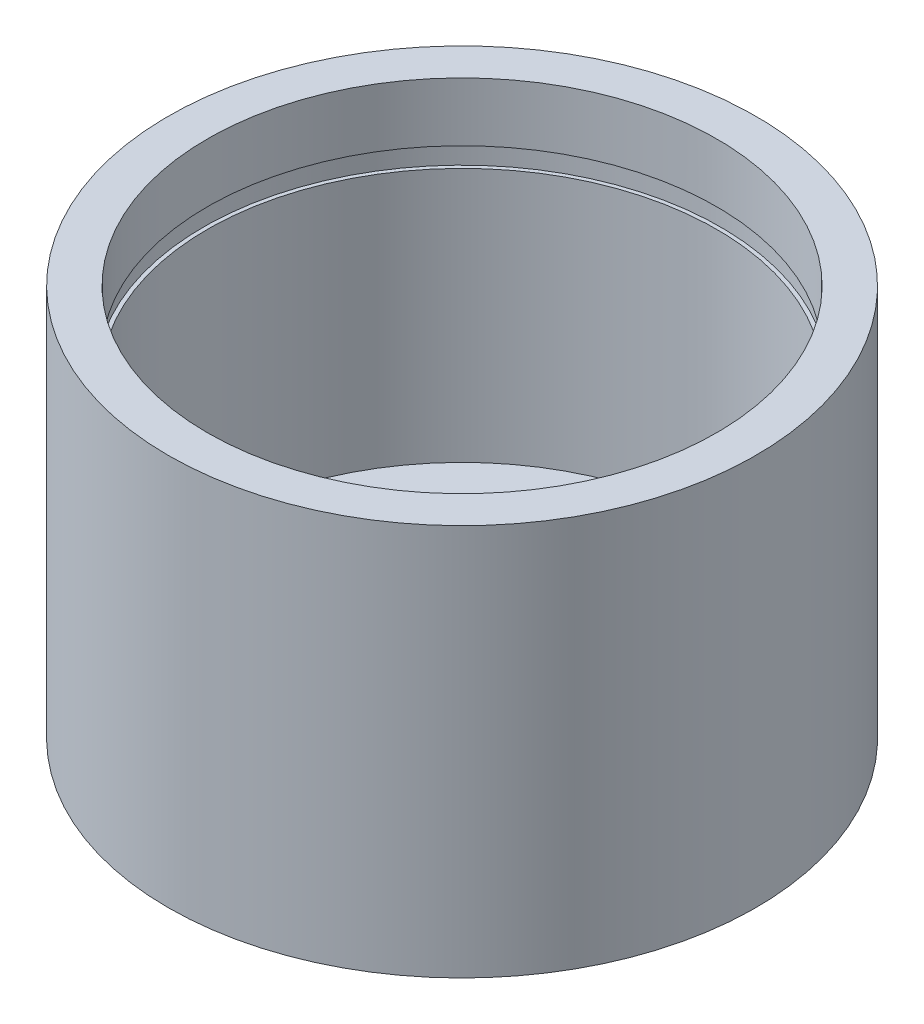
ISO-10303-21;
HEADER;
FILE_DESCRIPTION(('STEP AP214'),'2;1');
FILE_NAME('part.step','',(''),(''),'','','');
FILE_SCHEMA(('AUTOMOTIVE_DESIGN { 1 0 10303 214 1 1 1 1 }'));
ENDSEC;
DATA;
#1=APPLICATION_CONTEXT('core data for automotive mechanical design processes');
#2=APPLICATION_PROTOCOL_DEFINITION('international standard','automotive_design',2000,#1);
#3=PRODUCT_CONTEXT('',#1,'mechanical');
#4=PRODUCT('Part','Part','',(#3));
#5=PRODUCT_RELATED_PRODUCT_CATEGORY('part','',(#4));
#6=PRODUCT_DEFINITION_FORMATION('','',#4);
#7=PRODUCT_DEFINITION_CONTEXT('part definition',#1,'design');
#8=PRODUCT_DEFINITION('design','',#6,#7);
#9=PRODUCT_DEFINITION_SHAPE('','',#8);
#10=(LENGTH_UNIT() NAMED_UNIT(*) SI_UNIT(.MILLI.,.METRE.));
#11=(NAMED_UNIT(*) PLANE_ANGLE_UNIT() SI_UNIT($,.RADIAN.));
#12=(NAMED_UNIT(*) SI_UNIT($,.STERADIAN.) SOLID_ANGLE_UNIT());
#13=UNCERTAINTY_MEASURE_WITH_UNIT(LENGTH_MEASURE(1.E-05),#10,'distance_accuracy_value','');
#14=(GEOMETRIC_REPRESENTATION_CONTEXT(3) GLOBAL_UNCERTAINTY_ASSIGNED_CONTEXT((#13)) GLOBAL_UNIT_ASSIGNED_CONTEXT((#10,
#11,#12)) REPRESENTATION_CONTEXT('',''));
#15=CARTESIAN_POINT('',(0.,0.,0.));
#16=DIRECTION('',(0.,0.,1.));
#17=DIRECTION('',(1.,0.,0.));
#18=AXIS2_PLACEMENT_3D('',#15,#16,#17);
#19=CARTESIAN_POINT('',(0.,1.5,0.));
#20=DIRECTION('',(0.,1.,0.));
#21=DIRECTION('',(0.,0.,1.));
#22=AXIS2_PLACEMENT_3D('',#19,#20,#21);
#23=CYLINDRICAL_SURFACE('',#22,6.5);
#24=CARTESIAN_POINT('',(0.,10.,0.));
#25=DIRECTION('',(0.,1.,0.));
#26=DIRECTION('',(0.,0.,1.));
#27=AXIS2_PLACEMENT_3D('',#24,#25,#26);
#28=CIRCLE('',#27,6.5);
#29=CARTESIAN_POINT('',(0.,10.,6.5));
#30=VERTEX_POINT('',#29);
#31=EDGE_CURVE('E59',#30,#30,#28,.T.);
#32=ORIENTED_EDGE('',*,*,#31,.T.);
#33=EDGE_LOOP('',(#32));
#34=FACE_BOUND('',#33,.T.);
#35=CARTESIAN_POINT('',(0.,8.5,0.));
#36=DIRECTION('',(0.,1.,0.));
#37=DIRECTION('',(-0.413653547118569,0.,-0.910434370482698));
#38=AXIS2_PLACEMENT_3D('',#35,#36,#37);
#39=CIRCLE('',#38,6.5);
#40=CARTESIAN_POINT('',(-2.6887480562707,8.5,-5.91782340813754));
#41=VERTEX_POINT('',#40);
#42=EDGE_CURVE('E74',#41,#41,#39,.T.);
#43=ORIENTED_EDGE('',*,*,#42,.F.);
#44=EDGE_LOOP('',(#43));
#45=FACE_BOUND('',#44,.T.);
#46=ADVANCED_FACE('F42',(#34,#45),#23,.F.);
#47=CARTESIAN_POINT('',(0.,10.,0.));
#48=DIRECTION('',(0.,-1.,0.));
#49=DIRECTION('',(0.,0.,-1.));
#50=AXIS2_PLACEMENT_3D('',#47,#48,#49);
#51=CYLINDRICAL_SURFACE('',#50,7.5);
#52=CARTESIAN_POINT('',(0.,10.,0.));
#53=DIRECTION('',(0.,1.,0.));
#54=DIRECTION('',(0.,0.,1.));
#55=AXIS2_PLACEMENT_3D('',#52,#53,#54);
#56=CIRCLE('',#55,7.5);
#57=CARTESIAN_POINT('',(0.,10.,7.5));
#58=VERTEX_POINT('',#57);
#59=EDGE_CURVE('E10',#58,#58,#56,.T.);
#60=ORIENTED_EDGE('',*,*,#59,.F.);
#61=EDGE_LOOP('',(#60));
#62=FACE_BOUND('',#61,.T.);
#63=CARTESIAN_POINT('',(0.,0.,0.));
#64=DIRECTION('',(0.,1.,0.));
#65=DIRECTION('',(0.,0.,1.));
#66=AXIS2_PLACEMENT_3D('',#63,#64,#65);
#67=CIRCLE('',#66,7.5);
#68=CARTESIAN_POINT('',(0.,0.,7.5));
#69=VERTEX_POINT('',#68);
#70=EDGE_CURVE('E51',#69,#69,#67,.T.);
#71=ORIENTED_EDGE('',*,*,#70,.T.);
#72=EDGE_LOOP('',(#71));
#73=FACE_BOUND('',#72,.T.);
#74=ADVANCED_FACE('F44',(#62,#73),#51,.T.);
#75=CARTESIAN_POINT('',(0.,10.,0.));
#76=DIRECTION('',(0.,1.,0.));
#77=DIRECTION('',(0.,0.,1.));
#78=AXIS2_PLACEMENT_3D('',#75,#76,#77);
#79=PLANE('',#78);
#80=ORIENTED_EDGE('',*,*,#31,.F.);
#81=EDGE_LOOP('',(#80));
#82=FACE_BOUND('',#81,.T.);
#83=ORIENTED_EDGE('',*,*,#59,.T.);
#84=EDGE_LOOP('',(#83));
#85=FACE_BOUND('',#84,.T.);
#86=ADVANCED_FACE('F91',(#82,#85),#79,.T.);
#87=CARTESIAN_POINT('',(0.,0.,0.));
#88=DIRECTION('',(0.,1.,0.));
#89=DIRECTION('',(0.,0.,1.));
#90=AXIS2_PLACEMENT_3D('',#87,#88,#89);
#91=PLANE('',#90);
#92=ORIENTED_EDGE('',*,*,#70,.F.);
#93=EDGE_LOOP('',(#92));
#94=FACE_BOUND('',#93,.T.);
#95=ADVANCED_FACE('F110',(#94),#91,.F.);
#96=CARTESIAN_POINT('',(6.00886684518581,8.,-2.73011341098255));
#97=DIRECTION('',(0.,1.,0.));
#98=DIRECTION('',(-0.413653547118569,0.,-0.910434370482698));
#99=AXIS2_PLACEMENT_3D('',#96,#97,#98);
#100=PLANE('',#99);
#101=CARTESIAN_POINT('',(0.,8.,0.));
#102=DIRECTION('',(0.,1.,0.));
#103=DIRECTION('',(-0.413653547118569,0.,-0.910434370482698));
#104=AXIS2_PLACEMENT_3D('',#101,#102,#103);
#105=CIRCLE('',#104,6.6);
#106=CARTESIAN_POINT('',(-2.73011341098255,8.,-6.00886684518581));
#107=VERTEX_POINT('',#106);
#108=EDGE_CURVE('E66',#107,#107,#105,.T.);
#109=ORIENTED_EDGE('',*,*,#108,.T.);
#110=EDGE_LOOP('',(#109));
#111=FACE_BOUND('',#110,.T.);
#112=CARTESIAN_POINT('',(0.,8.,0.));
#113=DIRECTION('',(0.,1.,0.));
#114=DIRECTION('',(0.,0.,1.));
#115=AXIS2_PLACEMENT_3D('',#112,#113,#114);
#116=CIRCLE('',#115,6.5);
#117=CARTESIAN_POINT('',(0.,8.,6.5));
#118=VERTEX_POINT('',#117);
#119=EDGE_CURVE('E46',#118,#118,#116,.F.);
#120=ORIENTED_EDGE('',*,*,#119,.T.);
#121=EDGE_LOOP('',(#120));
#122=FACE_BOUND('',#121,.T.);
#123=ADVANCED_FACE('F108',(#111,#122),#100,.T.);
#124=CARTESIAN_POINT('',(0.,18.5,0.));
#125=DIRECTION('',(0.,1.,0.));
#126=DIRECTION('',(-0.413653547118569,0.,-0.910434370482698));
#127=AXIS2_PLACEMENT_3D('',#124,#125,#126);
#128=CYLINDRICAL_SURFACE('',#127,6.6);
#129=CARTESIAN_POINT('',(0.,8.5,0.));
#130=DIRECTION('',(0.,1.,0.));
#131=DIRECTION('',(-0.413653547118569,0.,-0.910434370482698));
#132=AXIS2_PLACEMENT_3D('',#129,#130,#131);
#133=CIRCLE('',#132,6.6);
#134=CARTESIAN_POINT('',(-2.73011341098255,8.5,-6.00886684518581));
#135=VERTEX_POINT('',#134);
#136=EDGE_CURVE('E70',#135,#135,#133,.T.);
#137=ORIENTED_EDGE('',*,*,#136,.T.);
#138=EDGE_LOOP('',(#137));
#139=FACE_BOUND('',#138,.T.);
#140=ORIENTED_EDGE('',*,*,#108,.F.);
#141=EDGE_LOOP('',(#140));
#142=FACE_BOUND('',#141,.T.);
#143=ADVANCED_FACE('F109',(#139,#142),#128,.F.);
#144=CARTESIAN_POINT('',(5.91782340813754,8.5,-2.6887480562707));
#145=DIRECTION('',(0.,-1.,0.));
#146=DIRECTION('',(0.413653547118569,0.,0.910434370482698));
#147=AXIS2_PLACEMENT_3D('',#144,#145,#146);
#148=PLANE('',#147);
#149=ORIENTED_EDGE('',*,*,#42,.T.);
#150=EDGE_LOOP('',(#149));
#151=FACE_BOUND('',#150,.T.);
#152=ORIENTED_EDGE('',*,*,#136,.F.);
#153=EDGE_LOOP('',(#152));
#154=FACE_BOUND('',#153,.T.);
#155=ADVANCED_FACE('F79',(#151,#154),#148,.T.);
#156=CARTESIAN_POINT('',(0.,1.5,0.));
#157=DIRECTION('',(0.,1.,0.));
#158=DIRECTION('',(0.,0.,1.));
#159=AXIS2_PLACEMENT_3D('',#156,#157,#158);
#160=PLANE('',#159);
#161=CARTESIAN_POINT('',(0.,1.5,0.));
#162=DIRECTION('',(0.,1.,0.));
#163=DIRECTION('',(0.,0.,1.));
#164=AXIS2_PLACEMENT_3D('',#161,#162,#163);
#165=CIRCLE('',#164,6.5);
#166=CARTESIAN_POINT('',(0.,1.5,6.5));
#167=VERTEX_POINT('',#166);
#168=EDGE_CURVE('E57',#167,#167,#165,.T.);
#169=ORIENTED_EDGE('',*,*,#168,.T.);
#170=EDGE_LOOP('',(#169));
#171=FACE_BOUND('',#170,.T.);
#172=ADVANCED_FACE('F96',(#171),#160,.T.);
#173=ORIENTED_EDGE('',*,*,#168,.F.);
#174=EDGE_LOOP('',(#173));
#175=FACE_BOUND('',#174,.T.);
#176=ORIENTED_EDGE('',*,*,#119,.F.);
#177=EDGE_LOOP('',(#176));
#178=FACE_BOUND('',#177,.T.);
#179=ADVANCED_FACE('F85',(#175,#178),#23,.F.);
#180=CLOSED_SHELL('',(#46,#74,#86,#95,#123,#143,#155,#172,#179));
#181=MANIFOLD_SOLID_BREP('B2',#180);
#182=ADVANCED_BREP_SHAPE_REPRESENTATION('',(#18,#181),#14);
#183=SHAPE_DEFINITION_REPRESENTATION(#9,#182);
ENDSEC;
END-ISO-10303-21;
